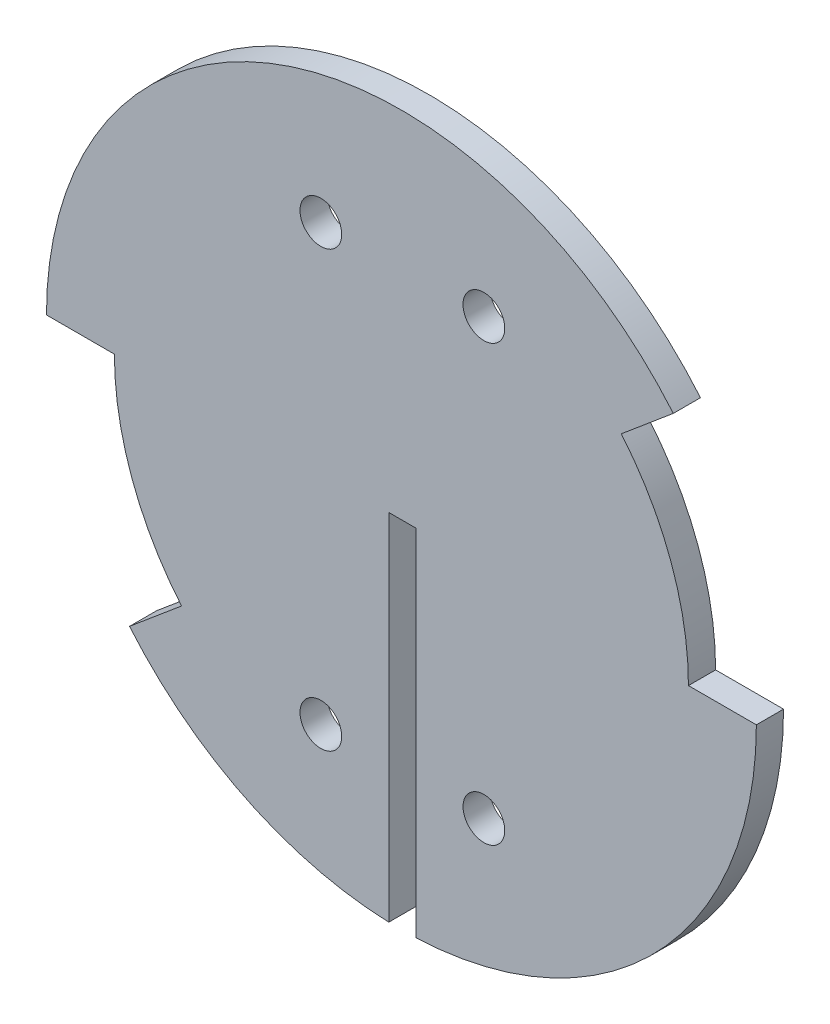
ISO-10303-21;
HEADER;
FILE_DESCRIPTION(('STEP AP214'),'2;1');
FILE_NAME('part.step','',(''),(''),'','','');
FILE_SCHEMA(('AUTOMOTIVE_DESIGN { 1 0 10303 214 1 1 1 1 }'));
ENDSEC;
DATA;
#1=APPLICATION_CONTEXT('core data for automotive mechanical design processes');
#2=APPLICATION_PROTOCOL_DEFINITION('international standard','automotive_design',2000,#1);
#3=PRODUCT_CONTEXT('',#1,'mechanical');
#4=PRODUCT('Part','Part','',(#3));
#5=PRODUCT_RELATED_PRODUCT_CATEGORY('part','',(#4));
#6=PRODUCT_DEFINITION_FORMATION('','',#4);
#7=PRODUCT_DEFINITION_CONTEXT('part definition',#1,'design');
#8=PRODUCT_DEFINITION('design','',#6,#7);
#9=PRODUCT_DEFINITION_SHAPE('','',#8);
#10=(LENGTH_UNIT() NAMED_UNIT(*) SI_UNIT(.MILLI.,.METRE.));
#11=(NAMED_UNIT(*) PLANE_ANGLE_UNIT() SI_UNIT($,.RADIAN.));
#12=(NAMED_UNIT(*) SI_UNIT($,.STERADIAN.) SOLID_ANGLE_UNIT());
#13=UNCERTAINTY_MEASURE_WITH_UNIT(LENGTH_MEASURE(1.E-05),#10,'distance_accuracy_value','');
#14=(GEOMETRIC_REPRESENTATION_CONTEXT(3) GLOBAL_UNCERTAINTY_ASSIGNED_CONTEXT((#13)) GLOBAL_UNIT_ASSIGNED_CONTEXT((#10,
#11,#12)) REPRESENTATION_CONTEXT('',''));
#15=CARTESIAN_POINT('',(0.,0.,0.));
#16=DIRECTION('',(0.,0.,1.));
#17=DIRECTION('',(1.,0.,0.));
#18=AXIS2_PLACEMENT_3D('',#15,#16,#17);
#19=CARTESIAN_POINT('',(0.,0.,5.08));
#20=DIRECTION('',(0.,0.,-1.));
#21=DIRECTION('',(-1.,0.,0.));
#22=AXIS2_PLACEMENT_3D('',#19,#20,#21);
#23=CYLINDRICAL_SURFACE('',#22,66.3575);
#24=DIRECTION('',(0.,0.,-1.));
#25=VECTOR('',#24,1.);
#26=CARTESIAN_POINT('',(2.71807751956726,-66.3018088806604,5.08));
#27=LINE('',#26,#25);
#28=CARTESIAN_POINT('',(2.71807751956726,-66.3018088806604,5.08));
#29=VERTEX_POINT('',#28);
#30=CARTESIAN_POINT('',(2.71807751956726,-66.3018088806604,0.));
#31=VERTEX_POINT('',#30);
#32=EDGE_CURVE('E125',#29,#31,#27,.T.);
#33=ORIENTED_EDGE('',*,*,#32,.T.);
#34=CARTESIAN_POINT('',(0.,0.,0.));
#35=DIRECTION('',(0.,0.,1.));
#36=DIRECTION('',(1.,0.,0.));
#37=AXIS2_PLACEMENT_3D('',#34,#35,#36);
#38=CIRCLE('',#37,66.3575);
#39=CARTESIAN_POINT('',(66.3575,0.,0.));
#40=VERTEX_POINT('',#39);
#41=EDGE_CURVE('E58',#31,#40,#38,.T.);
#42=ORIENTED_EDGE('',*,*,#41,.T.);
#43=DIRECTION('',(0.,0.,-1.));
#44=VECTOR('',#43,1.);
#45=CARTESIAN_POINT('',(66.3575,0.,5.081));
#46=LINE('',#45,#44);
#47=CARTESIAN_POINT('',(66.3575,0.,5.08));
#48=VERTEX_POINT('',#47);
#49=EDGE_CURVE('E143',#48,#40,#46,.T.);
#50=ORIENTED_EDGE('',*,*,#49,.F.);
#51=CARTESIAN_POINT('',(0.,0.,5.08));
#52=DIRECTION('',(0.,0.,1.));
#53=DIRECTION('',(1.,0.,0.));
#54=AXIS2_PLACEMENT_3D('',#51,#52,#53);
#55=CIRCLE('',#54,66.3575);
#56=EDGE_CURVE('E42',#29,#48,#55,.T.);
#57=ORIENTED_EDGE('',*,*,#56,.F.);
#58=EDGE_LOOP('',(#33,#42,#50,#57));
#59=FACE_BOUND('',#58,.T.);
#60=ADVANCED_FACE('F33',(#59),#23,.T.);
#61=CARTESIAN_POINT('',(0.,0.,5.08));
#62=DIRECTION('',(0.,0.,1.));
#63=DIRECTION('',(1.,0.,0.));
#64=AXIS2_PLACEMENT_3D('',#61,#62,#63);
#65=PLANE('',#64);
#66=CARTESIAN_POINT('',(-15.0619224804327,40.64,5.08));
#67=DIRECTION('',(0.,0.,1.));
#68=DIRECTION('',(1.,0.,0.));
#69=AXIS2_PLACEMENT_3D('',#66,#67,#68);
#70=CIRCLE('',#69,3.90061697542542);
#71=CARTESIAN_POINT('',(-11.1613055050073,40.64,5.08));
#72=VERTEX_POINT('',#71);
#73=EDGE_CURVE('E214',#72,#72,#70,.F.);
#74=ORIENTED_EDGE('',*,*,#73,.T.);
#75=EDGE_LOOP('',(#74));
#76=FACE_BOUND('',#75,.T.);
#77=CARTESIAN_POINT('',(15.4180775195673,40.64,5.08));
#78=DIRECTION('',(0.,0.,1.));
#79=DIRECTION('',(1.,0.,0.));
#80=AXIS2_PLACEMENT_3D('',#77,#78,#79);
#81=CIRCLE('',#80,3.90061697542542);
#82=CARTESIAN_POINT('',(19.3186944949927,40.64,5.08));
#83=VERTEX_POINT('',#82);
#84=EDGE_CURVE('E210',#83,#83,#81,.F.);
#85=ORIENTED_EDGE('',*,*,#84,.T.);
#86=EDGE_LOOP('',(#85));
#87=FACE_BOUND('',#86,.T.);
#88=CARTESIAN_POINT('',(-15.0619224804327,-40.64,5.08));
#89=DIRECTION('',(0.,0.,1.));
#90=DIRECTION('',(1.,0.,0.));
#91=AXIS2_PLACEMENT_3D('',#88,#89,#90);
#92=CIRCLE('',#91,3.90061697542542);
#93=CARTESIAN_POINT('',(-11.1613055050073,-40.64,5.08));
#94=VERTEX_POINT('',#93);
#95=EDGE_CURVE('E207',#94,#94,#92,.T.);
#96=ORIENTED_EDGE('',*,*,#95,.F.);
#97=EDGE_LOOP('',(#96));
#98=FACE_BOUND('',#97,.T.);
#99=CARTESIAN_POINT('',(15.4180775195673,-40.64,5.08));
#100=DIRECTION('',(0.,0.,1.));
#101=DIRECTION('',(1.,0.,0.));
#102=AXIS2_PLACEMENT_3D('',#99,#100,#101);
#103=CIRCLE('',#102,3.90061697542542);
#104=CARTESIAN_POINT('',(19.3186944949927,-40.64,5.08));
#105=VERTEX_POINT('',#104);
#106=EDGE_CURVE('E201',#105,#105,#103,.T.);
#107=ORIENTED_EDGE('',*,*,#106,.F.);
#108=EDGE_LOOP('',(#107));
#109=FACE_BOUND('',#108,.T.);
#110=DIRECTION('',(-1.,0.,0.));
#111=VECTOR('',#110,1.);
#112=CARTESIAN_POINT('',(2.71807751956726,0.0228517898858138,5.08));
#113=LINE('',#112,#111);
#114=CARTESIAN_POINT('',(2.71807751956726,0.0228517898858138,5.08));
#115=VERTEX_POINT('',#114);
#116=CARTESIAN_POINT('',(-2.36192248043274,0.0228517898858138,5.08));
#117=VERTEX_POINT('',#116);
#118=EDGE_CURVE('E134',#115,#117,#113,.T.);
#119=ORIENTED_EDGE('',*,*,#118,.F.);
#120=DIRECTION('',(0.,1.,0.));
#121=VECTOR('',#120,1.);
#122=CARTESIAN_POINT('',(2.71807751956726,-67.8586482101142,5.08));
#123=LINE('',#122,#121);
#124=EDGE_CURVE('E128',#29,#115,#123,.T.);
#125=ORIENTED_EDGE('',*,*,#124,.F.);
#126=ORIENTED_EDGE('',*,*,#56,.T.);
#127=DIRECTION('',(1.,0.,0.));
#128=VECTOR('',#127,1.);
#129=CARTESIAN_POINT('',(0.,-1.94868254120031E-12,5.08));
#130=LINE('',#129,#128);
#131=CARTESIAN_POINT('',(53.6575,-3.72953596401974E-13,5.08));
#132=VERTEX_POINT('',#131);
#133=EDGE_CURVE('E196',#132,#48,#130,.T.);
#134=ORIENTED_EDGE('',*,*,#133,.F.);
#135=CARTESIAN_POINT('',(0.,0.,5.08));
#136=DIRECTION('',(0.,0.,1.));
#137=DIRECTION('',(1.,0.,0.));
#138=AXIS2_PLACEMENT_3D('',#135,#136,#137);
#139=CIRCLE('',#138,53.6575);
#140=CARTESIAN_POINT('',(41.1040297066567,34.4903761667553,5.08));
#141=VERTEX_POINT('',#140);
#142=EDGE_CURVE('E174',#141,#132,#139,.F.);
#143=ORIENTED_EDGE('',*,*,#142,.F.);
#144=DIRECTION('',(0.766044443118981,0.642787609686536,0.));
#145=VECTOR('',#144,1.);
#146=CARTESIAN_POINT('',(0.,0.,5.08));
#147=LINE('',#146,#145);
#148=CARTESIAN_POINT('',(50.8327941342678,42.6537788097743,5.08));
#149=VERTEX_POINT('',#148);
#150=EDGE_CURVE('E177',#141,#149,#147,.T.);
#151=ORIENTED_EDGE('',*,*,#150,.T.);
#152=CARTESIAN_POINT('',(-66.3575,0.,5.08));
#153=VERTEX_POINT('',#152);
#154=EDGE_CURVE('E43',#149,#153,#55,.T.);
#155=ORIENTED_EDGE('',*,*,#154,.T.);
#156=DIRECTION('',(-1.,0.,0.));
#157=VECTOR('',#156,1.);
#158=CARTESIAN_POINT('',(0.,0.,5.08));
#159=LINE('',#158,#157);
#160=CARTESIAN_POINT('',(-53.6575,0.,5.08));
#161=VERTEX_POINT('',#160);
#162=EDGE_CURVE('E168',#161,#153,#159,.T.);
#163=ORIENTED_EDGE('',*,*,#162,.F.);
#164=CARTESIAN_POINT('',(0.,0.,5.08));
#165=DIRECTION('',(0.,0.,1.));
#166=DIRECTION('',(1.,0.,0.));
#167=AXIS2_PLACEMENT_3D('',#164,#165,#166);
#168=CIRCLE('',#167,53.6575);
#169=CARTESIAN_POINT('',(-41.1040297066565,-34.4903761667556,5.08));
#170=VERTEX_POINT('',#169);
#171=EDGE_CURVE('E145',#170,#161,#168,.F.);
#172=ORIENTED_EDGE('',*,*,#171,.F.);
#173=DIRECTION('',(-0.766044443118999,-0.642787609686514,0.));
#174=VECTOR('',#173,1.);
#175=CARTESIAN_POINT('',(1.22879474976241E-12,-1.46442055759036E-12,5.08));
#176=LINE('',#175,#174);
#177=CARTESIAN_POINT('',(-50.8327941342678,-42.6537788097743,5.08));
#178=VERTEX_POINT('',#177);
#179=EDGE_CURVE('E171',#170,#178,#176,.T.);
#180=ORIENTED_EDGE('',*,*,#179,.T.);
#181=CARTESIAN_POINT('',(-2.36192248043274,-66.3154516568079,5.08));
#182=VERTEX_POINT('',#181);
#183=EDGE_CURVE('E11',#178,#182,#55,.T.);
#184=ORIENTED_EDGE('',*,*,#183,.T.);
#185=DIRECTION('',(0.,1.,0.));
#186=VECTOR('',#185,1.);
#187=CARTESIAN_POINT('',(-2.36192248043274,-67.8586482101142,5.08));
#188=LINE('',#187,#186);
#189=EDGE_CURVE('E232',#182,#117,#188,.T.);
#190=ORIENTED_EDGE('',*,*,#189,.T.);
#191=EDGE_LOOP('',(#119,#125,#126,#134,#143,#151,#155,#163,#172,#180,#184,#190));
#192=FACE_BOUND('',#191,.T.);
#193=ADVANCED_FACE('F137',(#76,#87,#98,#109,#192),#65,.T.);
#194=CARTESIAN_POINT('',(0.,0.,0.));
#195=DIRECTION('',(0.,0.,1.));
#196=DIRECTION('',(1.,0.,0.));
#197=AXIS2_PLACEMENT_3D('',#194,#195,#196);
#198=PLANE('',#197);
#199=CARTESIAN_POINT('',(15.4180775195673,-40.64,0.));
#200=DIRECTION('',(0.,0.,1.));
#201=DIRECTION('',(1.,0.,0.));
#202=AXIS2_PLACEMENT_3D('',#199,#200,#201);
#203=CIRCLE('',#202,3.90061697542542);
#204=CARTESIAN_POINT('',(19.3186944949927,-40.64,0.));
#205=VERTEX_POINT('',#204);
#206=EDGE_CURVE('E198',#205,#205,#203,.T.);
#207=ORIENTED_EDGE('',*,*,#206,.T.);
#208=EDGE_LOOP('',(#207));
#209=FACE_BOUND('',#208,.T.);
#210=CARTESIAN_POINT('',(-15.0619224804327,-40.64,0.));
#211=DIRECTION('',(0.,0.,1.));
#212=DIRECTION('',(1.,0.,0.));
#213=AXIS2_PLACEMENT_3D('',#210,#211,#212);
#214=CIRCLE('',#213,3.90061697542542);
#215=CARTESIAN_POINT('',(-11.1613055050073,-40.64,0.));
#216=VERTEX_POINT('',#215);
#217=EDGE_CURVE('E204',#216,#216,#214,.T.);
#218=ORIENTED_EDGE('',*,*,#217,.T.);
#219=EDGE_LOOP('',(#218));
#220=FACE_BOUND('',#219,.T.);
#221=CARTESIAN_POINT('',(15.4180775195673,40.64,0.));
#222=DIRECTION('',(0.,0.,-1.));
#223=DIRECTION('',(-1.,0.,0.));
#224=AXIS2_PLACEMENT_3D('',#221,#222,#223);
#225=CIRCLE('',#224,3.90061697542542);
#226=CARTESIAN_POINT('',(11.5174605441418,40.64,0.));
#227=VERTEX_POINT('',#226);
#228=EDGE_CURVE('E211',#227,#227,#225,.T.);
#229=ORIENTED_EDGE('',*,*,#228,.F.);
#230=EDGE_LOOP('',(#229));
#231=FACE_BOUND('',#230,.T.);
#232=CARTESIAN_POINT('',(-15.0619224804327,40.64,0.));
#233=DIRECTION('',(0.,0.,-1.));
#234=DIRECTION('',(-1.,0.,0.));
#235=AXIS2_PLACEMENT_3D('',#232,#233,#234);
#236=CIRCLE('',#235,3.90061697542542);
#237=CARTESIAN_POINT('',(-18.9625394558582,40.64,0.));
#238=VERTEX_POINT('',#237);
#239=EDGE_CURVE('E217',#238,#238,#236,.T.);
#240=ORIENTED_EDGE('',*,*,#239,.F.);
#241=EDGE_LOOP('',(#240));
#242=FACE_BOUND('',#241,.T.);
#243=DIRECTION('',(0.,1.,0.));
#244=VECTOR('',#243,1.);
#245=CARTESIAN_POINT('',(2.71807751956726,-67.8586482101142,0.));
#246=LINE('',#245,#244);
#247=CARTESIAN_POINT('',(2.71807751956726,0.0228517898858138,0.));
#248=VERTEX_POINT('',#247);
#249=EDGE_CURVE('E131',#31,#248,#246,.T.);
#250=ORIENTED_EDGE('',*,*,#249,.T.);
#251=DIRECTION('',(-1.,0.,0.));
#252=VECTOR('',#251,1.);
#253=CARTESIAN_POINT('',(2.71807751956726,0.0228517898858138,0.));
#254=LINE('',#253,#252);
#255=CARTESIAN_POINT('',(-2.36192248043274,0.0228517898858138,0.));
#256=VERTEX_POINT('',#255);
#257=EDGE_CURVE('E225',#248,#256,#254,.T.);
#258=ORIENTED_EDGE('',*,*,#257,.T.);
#259=DIRECTION('',(0.,1.,0.));
#260=VECTOR('',#259,1.);
#261=CARTESIAN_POINT('',(-2.36192248043274,-67.8586482101142,0.));
#262=LINE('',#261,#260);
#263=CARTESIAN_POINT('',(-2.36192248043274,-66.3154516568079,0.));
#264=VERTEX_POINT('',#263);
#265=EDGE_CURVE('E50',#264,#256,#262,.T.);
#266=ORIENTED_EDGE('',*,*,#265,.F.);
#267=CARTESIAN_POINT('',(-50.8327941342678,-42.6537788097743,0.));
#268=VERTEX_POINT('',#267);
#269=EDGE_CURVE('E37',#268,#264,#38,.T.);
#270=ORIENTED_EDGE('',*,*,#269,.F.);
#271=DIRECTION('',(-0.766044443119,-0.642787609686514,0.));
#272=VECTOR('',#271,1.);
#273=CARTESIAN_POINT('',(1.22879474976241E-12,-1.46442055759036E-12,0.));
#274=LINE('',#273,#272);
#275=CARTESIAN_POINT('',(-41.1040297066565,-34.4903761667556,0.));
#276=VERTEX_POINT('',#275);
#277=EDGE_CURVE('E163',#276,#268,#274,.T.);
#278=ORIENTED_EDGE('',*,*,#277,.F.);
#279=CARTESIAN_POINT('',(0.,0.,0.));
#280=DIRECTION('',(0.,0.,1.));
#281=DIRECTION('',(1.,0.,0.));
#282=AXIS2_PLACEMENT_3D('',#279,#280,#281);
#283=CIRCLE('',#282,53.6575);
#284=CARTESIAN_POINT('',(-53.6575,0.,0.));
#285=VERTEX_POINT('',#284);
#286=EDGE_CURVE('E160',#276,#285,#283,.F.);
#287=ORIENTED_EDGE('',*,*,#286,.T.);
#288=DIRECTION('',(-1.,0.,0.));
#289=VECTOR('',#288,1.);
#290=CARTESIAN_POINT('',(0.,0.,0.));
#291=LINE('',#290,#289);
#292=CARTESIAN_POINT('',(-66.3575,0.,0.));
#293=VERTEX_POINT('',#292);
#294=EDGE_CURVE('E165',#285,#293,#291,.T.);
#295=ORIENTED_EDGE('',*,*,#294,.T.);
#296=CARTESIAN_POINT('',(50.8327941342678,42.6537788097743,0.));
#297=VERTEX_POINT('',#296);
#298=EDGE_CURVE('E148',#297,#293,#38,.T.);
#299=ORIENTED_EDGE('',*,*,#298,.F.);
#300=DIRECTION('',(0.766044443118981,0.642787609686536,0.));
#301=VECTOR('',#300,1.);
#302=CARTESIAN_POINT('',(0.,0.,0.));
#303=LINE('',#302,#301);
#304=CARTESIAN_POINT('',(41.1040297066567,34.4903761667553,0.));
#305=VERTEX_POINT('',#304);
#306=EDGE_CURVE('E180',#305,#297,#303,.T.);
#307=ORIENTED_EDGE('',*,*,#306,.F.);
#308=CARTESIAN_POINT('',(0.,0.,0.));
#309=DIRECTION('',(0.,0.,1.));
#310=DIRECTION('',(1.,0.,0.));
#311=AXIS2_PLACEMENT_3D('',#308,#309,#310);
#312=CIRCLE('',#311,53.6575);
#313=CARTESIAN_POINT('',(53.6575,-3.72953596401974E-13,0.));
#314=VERTEX_POINT('',#313);
#315=EDGE_CURVE('E182',#305,#314,#312,.F.);
#316=ORIENTED_EDGE('',*,*,#315,.T.);
#317=DIRECTION('',(1.,0.,0.));
#318=VECTOR('',#317,1.);
#319=CARTESIAN_POINT('',(0.,-1.94868254120031E-12,0.));
#320=LINE('',#319,#318);
#321=EDGE_CURVE('E185',#314,#40,#320,.T.);
#322=ORIENTED_EDGE('',*,*,#321,.T.);
#323=ORIENTED_EDGE('',*,*,#41,.F.);
#324=EDGE_LOOP('',(#250,#258,#266,#270,#278,#287,#295,#299,#307,#316,#322,#323));
#325=FACE_BOUND('',#324,.T.);
#326=ADVANCED_FACE('F251',(#209,#220,#231,#242,#325),#198,.F.);
#327=ORIENTED_EDGE('',*,*,#269,.T.);
#328=DIRECTION('',(0.,0.,-1.));
#329=VECTOR('',#328,1.);
#330=CARTESIAN_POINT('',(-2.36192248043274,-66.3154516568079,5.08));
#331=LINE('',#330,#329);
#332=EDGE_CURVE('E133',#182,#264,#331,.T.);
#333=ORIENTED_EDGE('',*,*,#332,.F.);
#334=ORIENTED_EDGE('',*,*,#183,.F.);
#335=DIRECTION('',(0.,0.,-1.));
#336=VECTOR('',#335,1.);
#337=CARTESIAN_POINT('',(-50.8327941342678,-42.6537788097743,5.081));
#338=LINE('',#337,#336);
#339=EDGE_CURVE('E152',#178,#268,#338,.T.);
#340=ORIENTED_EDGE('',*,*,#339,.T.);
#341=EDGE_LOOP('',(#327,#333,#334,#340));
#342=FACE_BOUND('',#341,.T.);
#343=ADVANCED_FACE('F239',(#342),#23,.T.);
#344=ORIENTED_EDGE('',*,*,#154,.F.);
#345=DIRECTION('',(0.,0.,-1.));
#346=VECTOR('',#345,1.);
#347=CARTESIAN_POINT('',(50.8327941342678,42.6537788097743,5.081));
#348=LINE('',#347,#346);
#349=EDGE_CURVE('E193',#149,#297,#348,.T.);
#350=ORIENTED_EDGE('',*,*,#349,.T.);
#351=ORIENTED_EDGE('',*,*,#298,.T.);
#352=DIRECTION('',(0.,0.,-1.));
#353=VECTOR('',#352,1.);
#354=CARTESIAN_POINT('',(-66.3575,0.,5.081));
#355=LINE('',#354,#353);
#356=EDGE_CURVE('E149',#153,#293,#355,.T.);
#357=ORIENTED_EDGE('',*,*,#356,.F.);
#358=EDGE_LOOP('',(#344,#350,#351,#357));
#359=FACE_BOUND('',#358,.T.);
#360=ADVANCED_FACE('F35',(#359),#23,.T.);
#361=CARTESIAN_POINT('',(0.,0.,5.081));
#362=DIRECTION('',(0.,-1.,0.));
#363=DIRECTION('',(1.,0.,0.));
#364=AXIS2_PLACEMENT_3D('',#361,#362,#363);
#365=PLANE('',#364);
#366=ORIENTED_EDGE('',*,*,#162,.T.);
#367=ORIENTED_EDGE('',*,*,#356,.T.);
#368=ORIENTED_EDGE('',*,*,#294,.F.);
#369=DIRECTION('',(0.,0.,-1.));
#370=VECTOR('',#369,1.);
#371=CARTESIAN_POINT('',(-53.6575,0.,5.081));
#372=LINE('',#371,#370);
#373=EDGE_CURVE('E157',#161,#285,#372,.T.);
#374=ORIENTED_EDGE('',*,*,#373,.F.);
#375=EDGE_LOOP('',(#366,#367,#368,#374));
#376=FACE_BOUND('',#375,.T.);
#377=ADVANCED_FACE('F249',(#376),#365,.T.);
#378=CARTESIAN_POINT('',(1.22879474976241E-12,-1.46442055759036E-12,5.081));
#379=DIRECTION('',(0.642787609686514,-0.766044443118999,0.));
#380=DIRECTION('',(0.766044443118999,0.642787609686514,0.));
#381=AXIS2_PLACEMENT_3D('',#378,#379,#380);
#382=PLANE('',#381);
#383=DIRECTION('',(0.,0.,-1.));
#384=VECTOR('',#383,1.);
#385=CARTESIAN_POINT('',(-41.1040297066565,-34.4903761667556,5.081));
#386=LINE('',#385,#384);
#387=EDGE_CURVE('E155',#170,#276,#386,.T.);
#388=ORIENTED_EDGE('',*,*,#387,.T.);
#389=ORIENTED_EDGE('',*,*,#277,.T.);
#390=ORIENTED_EDGE('',*,*,#339,.F.);
#391=ORIENTED_EDGE('',*,*,#179,.F.);
#392=EDGE_LOOP('',(#388,#389,#390,#391));
#393=FACE_BOUND('',#392,.T.);
#394=ADVANCED_FACE('F290',(#393),#382,.F.);
#395=CARTESIAN_POINT('',(0.,0.,5.081));
#396=DIRECTION('',(0.,0.,-1.));
#397=DIRECTION('',(-1.,0.,0.));
#398=AXIS2_PLACEMENT_3D('',#395,#396,#397);
#399=CYLINDRICAL_SURFACE('',#398,53.6575);
#400=ORIENTED_EDGE('',*,*,#171,.T.);
#401=ORIENTED_EDGE('',*,*,#373,.T.);
#402=ORIENTED_EDGE('',*,*,#286,.F.);
#403=ORIENTED_EDGE('',*,*,#387,.F.);
#404=EDGE_LOOP('',(#400,#401,#402,#403));
#405=FACE_BOUND('',#404,.T.);
#406=ADVANCED_FACE('F254',(#405),#399,.T.);
#407=CARTESIAN_POINT('',(0.,0.,5.081));
#408=DIRECTION('',(-0.642787609686536,0.766044443118981,0.));
#409=DIRECTION('',(-0.766044443118981,-0.642787609686536,0.));
#410=AXIS2_PLACEMENT_3D('',#407,#408,#409);
#411=PLANE('',#410);
#412=DIRECTION('',(0.,0.,-1.));
#413=VECTOR('',#412,1.);
#414=CARTESIAN_POINT('',(41.1040297066567,34.4903761667553,5.081));
#415=LINE('',#414,#413);
#416=EDGE_CURVE('E191',#141,#305,#415,.T.);
#417=ORIENTED_EDGE('',*,*,#416,.T.);
#418=ORIENTED_EDGE('',*,*,#306,.T.);
#419=ORIENTED_EDGE('',*,*,#349,.F.);
#420=ORIENTED_EDGE('',*,*,#150,.F.);
#421=EDGE_LOOP('',(#417,#418,#419,#420));
#422=FACE_BOUND('',#421,.T.);
#423=ADVANCED_FACE('F260',(#422),#411,.F.);
#424=CARTESIAN_POINT('',(0.,0.,5.081));
#425=DIRECTION('',(0.,0.,-1.));
#426=DIRECTION('',(-1.,0.,0.));
#427=AXIS2_PLACEMENT_3D('',#424,#425,#426);
#428=CYLINDRICAL_SURFACE('',#427,53.6575);
#429=ORIENTED_EDGE('',*,*,#142,.T.);
#430=DIRECTION('',(0.,0.,-1.));
#431=VECTOR('',#430,1.);
#432=CARTESIAN_POINT('',(53.6575,-3.72953596401974E-13,5.081));
#433=LINE('',#432,#431);
#434=EDGE_CURVE('E189',#132,#314,#433,.T.);
#435=ORIENTED_EDGE('',*,*,#434,.T.);
#436=ORIENTED_EDGE('',*,*,#315,.F.);
#437=ORIENTED_EDGE('',*,*,#416,.F.);
#438=EDGE_LOOP('',(#429,#435,#436,#437));
#439=FACE_BOUND('',#438,.T.);
#440=ADVANCED_FACE('F264',(#439),#428,.T.);
#441=CARTESIAN_POINT('',(0.,-1.94868254120031E-12,5.081));
#442=DIRECTION('',(0.,1.,0.));
#443=DIRECTION('',(-1.,0.,0.));
#444=AXIS2_PLACEMENT_3D('',#441,#442,#443);
#445=PLANE('',#444);
#446=ORIENTED_EDGE('',*,*,#133,.T.);
#447=ORIENTED_EDGE('',*,*,#49,.T.);
#448=ORIENTED_EDGE('',*,*,#321,.F.);
#449=ORIENTED_EDGE('',*,*,#434,.F.);
#450=EDGE_LOOP('',(#446,#447,#448,#449));
#451=FACE_BOUND('',#450,.T.);
#452=ADVANCED_FACE('F266',(#451),#445,.T.);
#453=CARTESIAN_POINT('',(15.4180775195673,-40.64,5.081));
#454=DIRECTION('',(0.,0.,-1.));
#455=DIRECTION('',(-1.,0.,0.));
#456=AXIS2_PLACEMENT_3D('',#453,#454,#455);
#457=CYLINDRICAL_SURFACE('',#456,3.90061697542542);
#458=ORIENTED_EDGE('',*,*,#106,.T.);
#459=EDGE_LOOP('',(#458));
#460=FACE_BOUND('',#459,.T.);
#461=ORIENTED_EDGE('',*,*,#206,.F.);
#462=EDGE_LOOP('',(#461));
#463=FACE_BOUND('',#462,.T.);
#464=ADVANCED_FACE('F268',(#460,#463),#457,.F.);
#465=CARTESIAN_POINT('',(-15.0619224804327,-40.64,5.081));
#466=DIRECTION('',(0.,0.,-1.));
#467=DIRECTION('',(-1.,0.,0.));
#468=AXIS2_PLACEMENT_3D('',#465,#466,#467);
#469=CYLINDRICAL_SURFACE('',#468,3.90061697542542);
#470=ORIENTED_EDGE('',*,*,#95,.T.);
#471=EDGE_LOOP('',(#470));
#472=FACE_BOUND('',#471,.T.);
#473=ORIENTED_EDGE('',*,*,#217,.F.);
#474=EDGE_LOOP('',(#473));
#475=FACE_BOUND('',#474,.T.);
#476=ADVANCED_FACE('F274',(#472,#475),#469,.F.);
#477=CARTESIAN_POINT('',(15.4180775195673,40.64,5.081));
#478=DIRECTION('',(0.,0.,-1.));
#479=DIRECTION('',(-1.,0.,0.));
#480=AXIS2_PLACEMENT_3D('',#477,#478,#479);
#481=CYLINDRICAL_SURFACE('',#480,3.90061697542542);
#482=ORIENTED_EDGE('',*,*,#84,.F.);
#483=EDGE_LOOP('',(#482));
#484=FACE_BOUND('',#483,.T.);
#485=ORIENTED_EDGE('',*,*,#228,.T.);
#486=EDGE_LOOP('',(#485));
#487=FACE_BOUND('',#486,.T.);
#488=ADVANCED_FACE('F311',(#484,#487),#481,.F.);
#489=CARTESIAN_POINT('',(-15.0619224804327,40.64,5.081));
#490=DIRECTION('',(0.,0.,-1.));
#491=DIRECTION('',(-1.,0.,0.));
#492=AXIS2_PLACEMENT_3D('',#489,#490,#491);
#493=CYLINDRICAL_SURFACE('',#492,3.90061697542542);
#494=ORIENTED_EDGE('',*,*,#73,.F.);
#495=EDGE_LOOP('',(#494));
#496=FACE_BOUND('',#495,.T.);
#497=ORIENTED_EDGE('',*,*,#239,.T.);
#498=EDGE_LOOP('',(#497));
#499=FACE_BOUND('',#498,.T.);
#500=ADVANCED_FACE('F309',(#496,#499),#493,.F.);
#501=CARTESIAN_POINT('',(2.71807751956726,-67.8586482101142,5.081));
#502=DIRECTION('',(-1.,0.,0.));
#503=DIRECTION('',(0.,0.,1.));
#504=AXIS2_PLACEMENT_3D('',#501,#502,#503);
#505=PLANE('',#504);
#506=ORIENTED_EDGE('',*,*,#124,.T.);
#507=DIRECTION('',(0.,0.,-1.));
#508=VECTOR('',#507,1.);
#509=CARTESIAN_POINT('',(2.71807751956726,0.0228517898858138,5.081));
#510=LINE('',#509,#508);
#511=EDGE_CURVE('E230',#115,#248,#510,.T.);
#512=ORIENTED_EDGE('',*,*,#511,.T.);
#513=ORIENTED_EDGE('',*,*,#249,.F.);
#514=ORIENTED_EDGE('',*,*,#32,.F.);
#515=EDGE_LOOP('',(#506,#512,#513,#514));
#516=FACE_BOUND('',#515,.T.);
#517=ADVANCED_FACE('F127',(#516),#505,.T.);
#518=CARTESIAN_POINT('',(-2.36192248043274,-67.8586482101142,5.081));
#519=DIRECTION('',(-1.,0.,0.));
#520=DIRECTION('',(0.,0.,1.));
#521=AXIS2_PLACEMENT_3D('',#518,#519,#520);
#522=PLANE('',#521);
#523=ORIENTED_EDGE('',*,*,#332,.T.);
#524=ORIENTED_EDGE('',*,*,#265,.T.);
#525=DIRECTION('',(0.,0.,-1.));
#526=VECTOR('',#525,1.);
#527=CARTESIAN_POINT('',(-2.36192248043274,0.0228517898858138,5.081));
#528=LINE('',#527,#526);
#529=EDGE_CURVE('E229',#117,#256,#528,.T.);
#530=ORIENTED_EDGE('',*,*,#529,.F.);
#531=ORIENTED_EDGE('',*,*,#189,.F.);
#532=EDGE_LOOP('',(#523,#524,#530,#531));
#533=FACE_BOUND('',#532,.T.);
#534=ADVANCED_FACE('F236',(#533),#522,.F.);
#535=CARTESIAN_POINT('',(2.71807751956726,0.0228517898858138,5.081));
#536=DIRECTION('',(0.,-1.,0.));
#537=DIRECTION('',(0.,0.,-1.));
#538=AXIS2_PLACEMENT_3D('',#535,#536,#537);
#539=PLANE('',#538);
#540=ORIENTED_EDGE('',*,*,#118,.T.);
#541=ORIENTED_EDGE('',*,*,#529,.T.);
#542=ORIENTED_EDGE('',*,*,#257,.F.);
#543=ORIENTED_EDGE('',*,*,#511,.F.);
#544=EDGE_LOOP('',(#540,#541,#542,#543));
#545=FACE_BOUND('',#544,.T.);
#546=ADVANCED_FACE('F414',(#545),#539,.T.);
#547=CLOSED_SHELL('',(#60,#193,#326,#343,#360,#377,#394,#406,#423,#440,#452,#464,#476,#488,#500,
#517,#534,#546));
#548=MANIFOLD_SOLID_BREP('B2',#547);
#549=ADVANCED_BREP_SHAPE_REPRESENTATION('',(#18,#548),#14);
#550=SHAPE_DEFINITION_REPRESENTATION(#9,#549);
ENDSEC;
END-ISO-10303-21;
